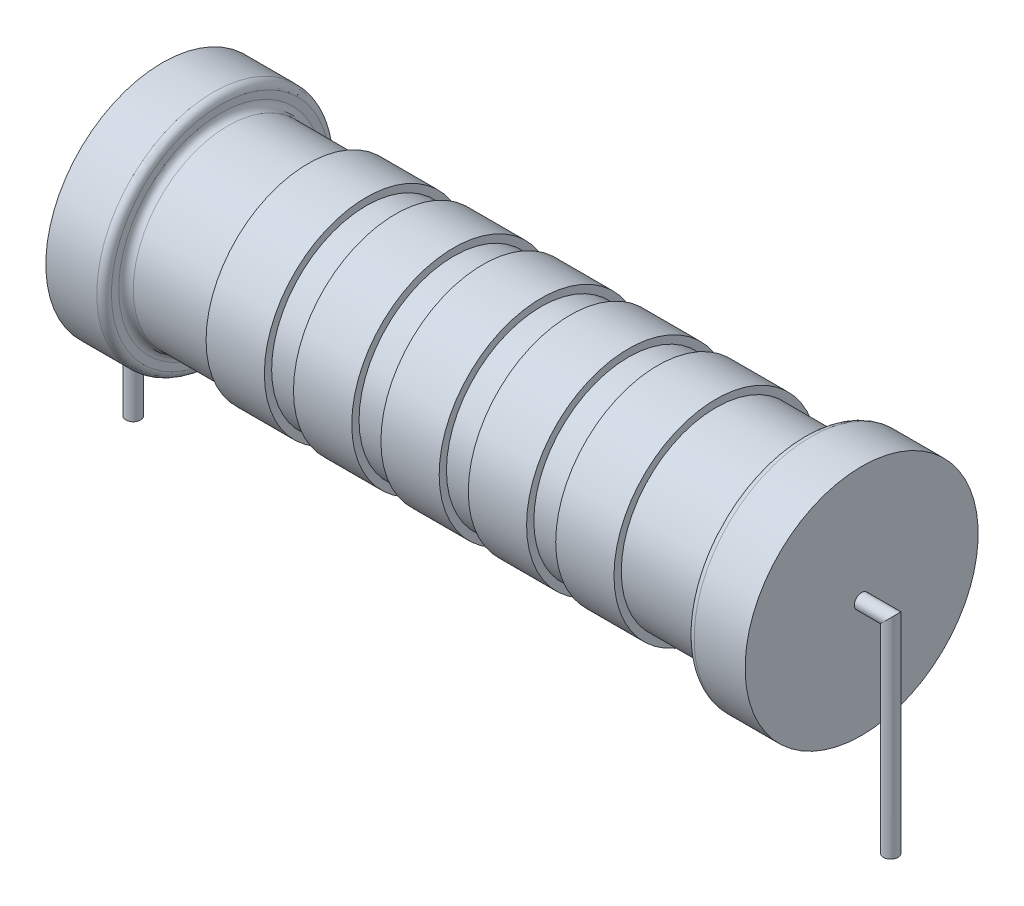
ISO-10303-21;
HEADER;
FILE_DESCRIPTION(('STEP AP214'),'2;1');
FILE_NAME('part.step','',(''),(''),'','','');
FILE_SCHEMA(('AUTOMOTIVE_DESIGN { 1 0 10303 214 1 1 1 1 }'));
ENDSEC;
DATA;
#1=APPLICATION_CONTEXT('core data for automotive mechanical design processes');
#2=APPLICATION_PROTOCOL_DEFINITION('international standard','automotive_design',2000,#1);
#3=PRODUCT_CONTEXT('',#1,'mechanical');
#4=PRODUCT('Part','Part','',(#3));
#5=PRODUCT_RELATED_PRODUCT_CATEGORY('part','',(#4));
#6=PRODUCT_DEFINITION_FORMATION('','',#4);
#7=PRODUCT_DEFINITION_CONTEXT('part definition',#1,'design');
#8=PRODUCT_DEFINITION('design','',#6,#7);
#9=PRODUCT_DEFINITION_SHAPE('','',#8);
#10=(LENGTH_UNIT() NAMED_UNIT(*) SI_UNIT(.MILLI.,.METRE.));
#11=(NAMED_UNIT(*) PLANE_ANGLE_UNIT() SI_UNIT($,.RADIAN.));
#12=(NAMED_UNIT(*) SI_UNIT($,.STERADIAN.) SOLID_ANGLE_UNIT());
#13=UNCERTAINTY_MEASURE_WITH_UNIT(LENGTH_MEASURE(1.E-05),#10,'distance_accuracy_value','');
#14=(GEOMETRIC_REPRESENTATION_CONTEXT(3) GLOBAL_UNCERTAINTY_ASSIGNED_CONTEXT((#13)) GLOBAL_UNIT_ASSIGNED_CONTEXT((#10,
#11,#12)) REPRESENTATION_CONTEXT('',''));
#15=CARTESIAN_POINT('',(0.,0.,0.));
#16=DIRECTION('',(0.,0.,1.));
#17=DIRECTION('',(1.,0.,0.));
#18=AXIS2_PLACEMENT_3D('',#15,#16,#17);
#19=CARTESIAN_POINT('',(-12.,0.,0.));
#20=DIRECTION('',(-1.,0.,0.));
#21=DIRECTION('',(0.,-1.,0.));
#22=AXIS2_PLACEMENT_3D('',#19,#20,#21);
#23=CYLINDRICAL_SURFACE('',#22,3.25000000000006);
#24=CARTESIAN_POINT('',(-4.,0.,0.));
#25=DIRECTION('',(1.,0.,0.));
#26=DIRECTION('',(0.,0.,-1.));
#27=AXIS2_PLACEMENT_3D('',#24,#25,#26);
#28=CIRCLE('',#27,3.25000000000006);
#29=CARTESIAN_POINT('',(-4.,0.,-3.25000000000006));
#30=VERTEX_POINT('',#29);
#31=EDGE_CURVE('E91',#30,#30,#28,.T.);
#32=ORIENTED_EDGE('',*,*,#31,.F.);
#33=EDGE_LOOP('',(#32));
#34=FACE_BOUND('',#33,.T.);
#35=CARTESIAN_POINT('',(-5.,0.,0.));
#36=DIRECTION('',(-1.,0.,0.));
#37=DIRECTION('',(0.,0.,1.));
#38=AXIS2_PLACEMENT_3D('',#35,#36,#37);
#39=CIRCLE('',#38,3.25000000000006);
#40=CARTESIAN_POINT('',(-5.,0.,3.25000000000006));
#41=VERTEX_POINT('',#40);
#42=EDGE_CURVE('E77',#41,#41,#39,.T.);
#43=ORIENTED_EDGE('',*,*,#42,.F.);
#44=EDGE_LOOP('',(#43));
#45=FACE_BOUND('',#44,.T.);
#46=ADVANCED_FACE('F62',(#34,#45),#23,.T.);
#47=CARTESIAN_POINT('',(-1.,0.,0.));
#48=DIRECTION('',(1.,0.,0.));
#49=DIRECTION('',(0.,0.,-1.));
#50=AXIS2_PLACEMENT_3D('',#47,#48,#49);
#51=CIRCLE('',#50,3.25000000000006);
#52=CARTESIAN_POINT('',(-1.,0.,-3.25000000000006));
#53=VERTEX_POINT('',#52);
#54=EDGE_CURVE('E115',#53,#53,#51,.T.);
#55=ORIENTED_EDGE('',*,*,#54,.F.);
#56=EDGE_LOOP('',(#55));
#57=FACE_BOUND('',#56,.T.);
#58=CARTESIAN_POINT('',(-2.,0.,0.));
#59=DIRECTION('',(-1.,0.,0.));
#60=DIRECTION('',(0.,0.,1.));
#61=AXIS2_PLACEMENT_3D('',#58,#59,#60);
#62=CIRCLE('',#61,3.25000000000006);
#63=CARTESIAN_POINT('',(-2.,0.,3.25000000000006));
#64=VERTEX_POINT('',#63);
#65=EDGE_CURVE('E88',#64,#64,#62,.T.);
#66=ORIENTED_EDGE('',*,*,#65,.F.);
#67=EDGE_LOOP('',(#66));
#68=FACE_BOUND('',#67,.T.);
#69=ADVANCED_FACE('F233',(#57,#68),#23,.T.);
#70=CARTESIAN_POINT('',(4.,0.,0.));
#71=DIRECTION('',(-1.,0.,0.));
#72=DIRECTION('',(0.,0.,1.));
#73=AXIS2_PLACEMENT_3D('',#70,#71,#72);
#74=CIRCLE('',#73,3.25000000000006);
#75=CARTESIAN_POINT('',(4.,0.,3.25000000000006));
#76=VERTEX_POINT('',#75);
#77=EDGE_CURVE('E103',#76,#76,#74,.T.);
#78=ORIENTED_EDGE('',*,*,#77,.F.);
#79=EDGE_LOOP('',(#78));
#80=FACE_BOUND('',#79,.T.);
#81=CARTESIAN_POINT('',(5.,0.,0.));
#82=DIRECTION('',(1.,0.,0.));
#83=DIRECTION('',(0.,0.,-1.));
#84=AXIS2_PLACEMENT_3D('',#81,#82,#83);
#85=CIRCLE('',#84,3.25000000000006);
#86=CARTESIAN_POINT('',(5.,0.,-3.25000000000006));
#87=VERTEX_POINT('',#86);
#88=EDGE_CURVE('E99',#87,#87,#85,.T.);
#89=ORIENTED_EDGE('',*,*,#88,.F.);
#90=EDGE_LOOP('',(#89));
#91=FACE_BOUND('',#90,.T.);
#92=ADVANCED_FACE('F240',(#80,#91),#23,.T.);
#93=CARTESIAN_POINT('',(0.999999999999999,0.,0.));
#94=DIRECTION('',(-1.,0.,0.));
#95=DIRECTION('',(0.,0.,1.));
#96=AXIS2_PLACEMENT_3D('',#93,#94,#95);
#97=CIRCLE('',#96,3.25000000000006);
#98=CARTESIAN_POINT('',(0.999999999999999,0.,3.25000000000006));
#99=VERTEX_POINT('',#98);
#100=EDGE_CURVE('E111',#99,#99,#97,.T.);
#101=ORIENTED_EDGE('',*,*,#100,.F.);
#102=EDGE_LOOP('',(#101));
#103=FACE_BOUND('',#102,.T.);
#104=CARTESIAN_POINT('',(2.,0.,0.));
#105=DIRECTION('',(1.,0.,0.));
#106=DIRECTION('',(0.,0.,-1.));
#107=AXIS2_PLACEMENT_3D('',#104,#105,#106);
#108=CIRCLE('',#107,3.25000000000006);
#109=CARTESIAN_POINT('',(2.,0.,-3.25000000000006));
#110=VERTEX_POINT('',#109);
#111=EDGE_CURVE('E107',#110,#110,#108,.T.);
#112=ORIENTED_EDGE('',*,*,#111,.F.);
#113=EDGE_LOOP('',(#112));
#114=FACE_BOUND('',#113,.T.);
#115=ADVANCED_FACE('F254',(#103,#114),#23,.T.);
#116=CARTESIAN_POINT('',(1.,3.00000000000006,0.));
#117=DIRECTION('',(-1.,0.,0.));
#118=DIRECTION('',(0.,0.,1.));
#119=AXIS2_PLACEMENT_3D('',#116,#117,#118);
#120=PLANE('',#119);
#121=ORIENTED_EDGE('',*,*,#100,.T.);
#122=EDGE_LOOP('',(#121));
#123=FACE_BOUND('',#122,.T.);
#124=CARTESIAN_POINT('',(0.99999999999989,0.,0.));
#125=DIRECTION('',(-1.,0.,0.));
#126=DIRECTION('',(0.,0.,1.));
#127=AXIS2_PLACEMENT_3D('',#124,#125,#126);
#128=CIRCLE('',#127,3.50000000000006);
#129=CARTESIAN_POINT('',(0.99999999999989,0.,3.50000000000006));
#130=VERTEX_POINT('',#129);
#131=EDGE_CURVE('E163',#130,#130,#128,.T.);
#132=ORIENTED_EDGE('',*,*,#131,.F.);
#133=EDGE_LOOP('',(#132));
#134=FACE_BOUND('',#133,.T.);
#135=ADVANCED_FACE('F267',(#123,#134),#120,.F.);
#136=CARTESIAN_POINT('',(-1.,3.00000000000006,0.));
#137=DIRECTION('',(1.,0.,0.));
#138=DIRECTION('',(0.,0.,-1.));
#139=AXIS2_PLACEMENT_3D('',#136,#137,#138);
#140=PLANE('',#139);
#141=ORIENTED_EDGE('',*,*,#54,.T.);
#142=EDGE_LOOP('',(#141));
#143=FACE_BOUND('',#142,.T.);
#144=CARTESIAN_POINT('',(-1.,0.,0.));
#145=DIRECTION('',(-1.,0.,0.));
#146=DIRECTION('',(0.,0.,1.));
#147=AXIS2_PLACEMENT_3D('',#144,#145,#146);
#148=CIRCLE('',#147,3.50000000000006);
#149=CARTESIAN_POINT('',(-1.,0.,3.50000000000006));
#150=VERTEX_POINT('',#149);
#151=EDGE_CURVE('E159',#150,#150,#148,.T.);
#152=ORIENTED_EDGE('',*,*,#151,.T.);
#153=EDGE_LOOP('',(#152));
#154=FACE_BOUND('',#153,.T.);
#155=ADVANCED_FACE('F273',(#143,#154),#140,.F.);
#156=CARTESIAN_POINT('',(-1000.,0.,0.));
#157=DIRECTION('',(-1.,0.,0.));
#158=DIRECTION('',(0.,0.,1.));
#159=AXIS2_PLACEMENT_3D('',#156,#157,#158);
#160=CYLINDRICAL_SURFACE('',#159,3.50000000000006);
#161=ORIENTED_EDGE('',*,*,#151,.F.);
#162=EDGE_LOOP('',(#161));
#163=FACE_BOUND('',#162,.T.);
#164=ORIENTED_EDGE('',*,*,#131,.T.);
#165=EDGE_LOOP('',(#164));
#166=FACE_BOUND('',#165,.T.);
#167=ADVANCED_FACE('F295',(#163,#166),#160,.T.);
#168=CARTESIAN_POINT('',(4.,3.00000000000006,0.));
#169=DIRECTION('',(-1.,0.,0.));
#170=DIRECTION('',(0.,0.,1.));
#171=AXIS2_PLACEMENT_3D('',#168,#169,#170);
#172=PLANE('',#171);
#173=ORIENTED_EDGE('',*,*,#77,.T.);
#174=EDGE_LOOP('',(#173));
#175=FACE_BOUND('',#174,.T.);
#176=CARTESIAN_POINT('',(4.,0.,0.));
#177=DIRECTION('',(-1.,0.,0.));
#178=DIRECTION('',(0.,0.,1.));
#179=AXIS2_PLACEMENT_3D('',#176,#177,#178);
#180=CIRCLE('',#179,3.50000000000006);
#181=CARTESIAN_POINT('',(4.,0.,3.50000000000006));
#182=VERTEX_POINT('',#181);
#183=EDGE_CURVE('E171',#182,#182,#180,.T.);
#184=ORIENTED_EDGE('',*,*,#183,.F.);
#185=EDGE_LOOP('',(#184));
#186=FACE_BOUND('',#185,.T.);
#187=ADVANCED_FACE('F284',(#175,#186),#172,.F.);
#188=CARTESIAN_POINT('',(2.,3.00000000000006,0.));
#189=DIRECTION('',(1.,0.,0.));
#190=DIRECTION('',(0.,0.,-1.));
#191=AXIS2_PLACEMENT_3D('',#188,#189,#190);
#192=PLANE('',#191);
#193=ORIENTED_EDGE('',*,*,#111,.T.);
#194=EDGE_LOOP('',(#193));
#195=FACE_BOUND('',#194,.T.);
#196=CARTESIAN_POINT('',(2.,0.,0.));
#197=DIRECTION('',(-1.,0.,0.));
#198=DIRECTION('',(0.,0.,1.));
#199=AXIS2_PLACEMENT_3D('',#196,#197,#198);
#200=CIRCLE('',#199,3.50000000000006);
#201=CARTESIAN_POINT('',(2.,0.,3.50000000000006));
#202=VERTEX_POINT('',#201);
#203=EDGE_CURVE('E167',#202,#202,#200,.T.);
#204=ORIENTED_EDGE('',*,*,#203,.T.);
#205=EDGE_LOOP('',(#204));
#206=FACE_BOUND('',#205,.T.);
#207=ADVANCED_FACE('F280',(#195,#206),#192,.F.);
#208=CARTESIAN_POINT('',(-1000.,0.,0.));
#209=DIRECTION('',(-1.,0.,0.));
#210=DIRECTION('',(0.,0.,1.));
#211=AXIS2_PLACEMENT_3D('',#208,#209,#210);
#212=CYLINDRICAL_SURFACE('',#211,3.50000000000006);
#213=ORIENTED_EDGE('',*,*,#203,.F.);
#214=EDGE_LOOP('',(#213));
#215=FACE_BOUND('',#214,.T.);
#216=ORIENTED_EDGE('',*,*,#183,.T.);
#217=EDGE_LOOP('',(#216));
#218=FACE_BOUND('',#217,.T.);
#219=ADVANCED_FACE('F283',(#215,#218),#212,.T.);
#220=CARTESIAN_POINT('',(7.,3.00000000000006,0.));
#221=DIRECTION('',(-1.,0.,0.));
#222=DIRECTION('',(0.,0.,1.));
#223=AXIS2_PLACEMENT_3D('',#220,#221,#222);
#224=PLANE('',#223);
#225=CARTESIAN_POINT('',(7.,0.,0.));
#226=DIRECTION('',(-1.,0.,0.));
#227=DIRECTION('',(0.,0.,1.));
#228=AXIS2_PLACEMENT_3D('',#225,#226,#227);
#229=CIRCLE('',#228,3.25000000000006);
#230=CARTESIAN_POINT('',(7.,0.,3.25000000000006));
#231=VERTEX_POINT('',#230);
#232=EDGE_CURVE('E95',#231,#231,#229,.T.);
#233=ORIENTED_EDGE('',*,*,#232,.T.);
#234=EDGE_LOOP('',(#233));
#235=FACE_BOUND('',#234,.T.);
#236=CARTESIAN_POINT('',(6.9999999999999,0.,0.));
#237=DIRECTION('',(-1.,0.,0.));
#238=DIRECTION('',(0.,0.,1.));
#239=AXIS2_PLACEMENT_3D('',#236,#237,#238);
#240=CIRCLE('',#239,3.50000000000006);
#241=CARTESIAN_POINT('',(6.9999999999999,0.,3.50000000000006));
#242=VERTEX_POINT('',#241);
#243=EDGE_CURVE('E179',#242,#242,#240,.T.);
#244=ORIENTED_EDGE('',*,*,#243,.F.);
#245=EDGE_LOOP('',(#244));
#246=FACE_BOUND('',#245,.T.);
#247=ADVANCED_FACE('F290',(#235,#246),#224,.F.);
#248=CARTESIAN_POINT('',(5.,3.00000000000006,0.));
#249=DIRECTION('',(1.,0.,0.));
#250=DIRECTION('',(0.,0.,-1.));
#251=AXIS2_PLACEMENT_3D('',#248,#249,#250);
#252=PLANE('',#251);
#253=ORIENTED_EDGE('',*,*,#88,.T.);
#254=EDGE_LOOP('',(#253));
#255=FACE_BOUND('',#254,.T.);
#256=CARTESIAN_POINT('',(4.99999999999989,0.,0.));
#257=DIRECTION('',(-1.,0.,0.));
#258=DIRECTION('',(0.,0.,1.));
#259=AXIS2_PLACEMENT_3D('',#256,#257,#258);
#260=CIRCLE('',#259,3.50000000000006);
#261=CARTESIAN_POINT('',(4.99999999999989,0.,3.50000000000006));
#262=VERTEX_POINT('',#261);
#263=EDGE_CURVE('E175',#262,#262,#260,.T.);
#264=ORIENTED_EDGE('',*,*,#263,.T.);
#265=EDGE_LOOP('',(#264));
#266=FACE_BOUND('',#265,.T.);
#267=ADVANCED_FACE('F340',(#255,#266),#252,.F.);
#268=CARTESIAN_POINT('',(-1000.,0.,0.));
#269=DIRECTION('',(-1.,0.,0.));
#270=DIRECTION('',(0.,0.,1.));
#271=AXIS2_PLACEMENT_3D('',#268,#269,#270);
#272=CYLINDRICAL_SURFACE('',#271,3.50000000000006);
#273=ORIENTED_EDGE('',*,*,#263,.F.);
#274=EDGE_LOOP('',(#273));
#275=FACE_BOUND('',#274,.T.);
#276=ORIENTED_EDGE('',*,*,#243,.T.);
#277=EDGE_LOOP('',(#276));
#278=FACE_BOUND('',#277,.T.);
#279=ADVANCED_FACE('F336',(#275,#278),#272,.T.);
#280=CARTESIAN_POINT('',(12.,0.,0.));
#281=DIRECTION('',(-1.,0.,0.));
#282=DIRECTION('',(0.,-1.,0.));
#283=AXIS2_PLACEMENT_3D('',#280,#281,#282);
#284=PLANE('',#283);
#285=CARTESIAN_POINT('',(12.,0.,0.));
#286=DIRECTION('',(-1.,0.,0.));
#287=DIRECTION('',(0.,-1.,0.));
#288=AXIS2_PLACEMENT_3D('',#285,#286,#287);
#289=CIRCLE('',#288,0.25);
#290=CARTESIAN_POINT('',(12.,-0.250000000000004,0.));
#291=VERTEX_POINT('',#290);
#292=EDGE_CURVE('E11',#291,#291,#289,.F.);
#293=ORIENTED_EDGE('',*,*,#292,.F.);
#294=EDGE_LOOP('',(#293));
#295=FACE_BOUND('',#294,.T.);
#296=CARTESIAN_POINT('',(12.,0.,0.));
#297=DIRECTION('',(-1.,0.,0.));
#298=DIRECTION('',(0.,-1.,0.));
#299=AXIS2_PLACEMENT_3D('',#296,#297,#298);
#300=CIRCLE('',#299,4.00000000000011);
#301=CARTESIAN_POINT('',(12.,-4.00000000000011,0.));
#302=VERTEX_POINT('',#301);
#303=EDGE_CURVE('E155',#302,#302,#300,.T.);
#304=ORIENTED_EDGE('',*,*,#303,.F.);
#305=EDGE_LOOP('',(#304));
#306=FACE_BOUND('',#305,.T.);
#307=ADVANCED_FACE('F339',(#295,#306),#284,.F.);
#308=CARTESIAN_POINT('',(-12.,0.,0.));
#309=DIRECTION('',(-1.,0.,0.));
#310=DIRECTION('',(0.,-1.,0.));
#311=AXIS2_PLACEMENT_3D('',#308,#309,#310);
#312=CYLINDRICAL_SURFACE('',#311,4.00000000000011);
#313=CARTESIAN_POINT('',(10.25,0.,0.));
#314=DIRECTION('',(1.,0.,0.));
#315=DIRECTION('',(0.,1.,0.));
#316=AXIS2_PLACEMENT_3D('',#313,#314,#315);
#317=CIRCLE('',#316,4.00000000000011);
#318=CARTESIAN_POINT('',(10.25,4.00000000000011,0.));
#319=VERTEX_POINT('',#318);
#320=EDGE_CURVE('E131',#319,#319,#317,.T.);
#321=ORIENTED_EDGE('',*,*,#320,.T.);
#322=EDGE_LOOP('',(#321));
#323=FACE_BOUND('',#322,.T.);
#324=ORIENTED_EDGE('',*,*,#303,.T.);
#325=EDGE_LOOP('',(#324));
#326=FACE_BOUND('',#325,.T.);
#327=ADVANCED_FACE('F366',(#323,#326),#312,.T.);
#328=CARTESIAN_POINT('',(10.25,0.,0.));
#329=DIRECTION('',(1.,0.,0.));
#330=DIRECTION('',(0.,1.,0.));
#331=AXIS2_PLACEMENT_3D('',#328,#329,#330);
#332=TOROIDAL_SURFACE('',#331,3.75000000000011,0.25);
#333=ORIENTED_EDGE('',*,*,#320,.F.);
#334=EDGE_LOOP('',(#333));
#335=FACE_BOUND('',#334,.T.);
#336=CARTESIAN_POINT('',(9.99999999999998,0.,0.));
#337=DIRECTION('',(1.,0.,0.));
#338=DIRECTION('',(0.,1.,0.));
#339=AXIS2_PLACEMENT_3D('',#336,#337,#338);
#340=CIRCLE('',#339,3.75000000000011);
#341=CARTESIAN_POINT('',(9.99999999999998,3.75000000000011,0.));
#342=VERTEX_POINT('',#341);
#343=EDGE_CURVE('E139',#342,#342,#340,.F.);
#344=ORIENTED_EDGE('',*,*,#343,.F.);
#345=EDGE_LOOP('',(#344));
#346=FACE_BOUND('',#345,.T.);
#347=ADVANCED_FACE('F373',(#335,#346),#332,.T.);
#348=CARTESIAN_POINT('',(9.99999999999998,4.00000000000011,0.));
#349=DIRECTION('',(1.,0.,0.));
#350=DIRECTION('',(0.,1.,0.));
#351=AXIS2_PLACEMENT_3D('',#348,#349,#350);
#352=PLANE('',#351);
#353=CARTESIAN_POINT('',(9.99999999999998,0.,0.));
#354=DIRECTION('',(1.,0.,0.));
#355=DIRECTION('',(0.,1.,0.));
#356=AXIS2_PLACEMENT_3D('',#353,#354,#355);
#357=CIRCLE('',#356,3.50000000000006);
#358=CARTESIAN_POINT('',(9.99999999999998,3.50000000000006,0.));
#359=VERTEX_POINT('',#358);
#360=EDGE_CURVE('E135',#359,#359,#357,.T.);
#361=ORIENTED_EDGE('',*,*,#360,.T.);
#362=EDGE_LOOP('',(#361));
#363=FACE_BOUND('',#362,.T.);
#364=ORIENTED_EDGE('',*,*,#343,.T.);
#365=EDGE_LOOP('',(#364));
#366=FACE_BOUND('',#365,.T.);
#367=ADVANCED_FACE('F262',(#363,#366),#352,.F.);
#368=CARTESIAN_POINT('',(9.74999999999998,0.,0.));
#369=DIRECTION('',(1.,0.,0.));
#370=DIRECTION('',(0.,1.,0.));
#371=AXIS2_PLACEMENT_3D('',#368,#369,#370);
#372=TOROIDAL_SURFACE('',#371,3.50000000000006,0.25);
#373=ORIENTED_EDGE('',*,*,#360,.F.);
#374=EDGE_LOOP('',(#373));
#375=FACE_BOUND('',#374,.T.);
#376=CARTESIAN_POINT('',(9.74999999999998,0.,0.));
#377=DIRECTION('',(1.,0.,0.));
#378=DIRECTION('',(0.,1.,0.));
#379=AXIS2_PLACEMENT_3D('',#376,#377,#378);
#380=CIRCLE('',#379,3.25000000000006);
#381=CARTESIAN_POINT('',(9.74999999999998,3.25000000000006,0.));
#382=VERTEX_POINT('',#381);
#383=EDGE_CURVE('E143',#382,#382,#380,.F.);
#384=ORIENTED_EDGE('',*,*,#383,.F.);
#385=EDGE_LOOP('',(#384));
#386=FACE_BOUND('',#385,.T.);
#387=ADVANCED_FACE('F252',(#375,#386),#372,.F.);
#388=ORIENTED_EDGE('',*,*,#383,.T.);
#389=EDGE_LOOP('',(#388));
#390=FACE_BOUND('',#389,.T.);
#391=ORIENTED_EDGE('',*,*,#232,.F.);
#392=EDGE_LOOP('',(#391));
#393=FACE_BOUND('',#392,.T.);
#394=ADVANCED_FACE('F236',(#390,#393),#23,.T.);
#395=CARTESIAN_POINT('',(-2.,3.00000000000004,0.));
#396=DIRECTION('',(-1.,0.,0.));
#397=DIRECTION('',(0.,0.,1.));
#398=AXIS2_PLACEMENT_3D('',#395,#396,#397);
#399=PLANE('',#398);
#400=ORIENTED_EDGE('',*,*,#65,.T.);
#401=EDGE_LOOP('',(#400));
#402=FACE_BOUND('',#401,.T.);
#403=CARTESIAN_POINT('',(-2.,0.,0.));
#404=DIRECTION('',(-1.,0.,0.));
#405=DIRECTION('',(0.,0.,1.));
#406=AXIS2_PLACEMENT_3D('',#403,#404,#405);
#407=CIRCLE('',#406,3.50000000000004);
#408=CARTESIAN_POINT('',(-2.,0.,3.50000000000004));
#409=VERTEX_POINT('',#408);
#410=EDGE_CURVE('E186',#409,#409,#407,.T.);
#411=ORIENTED_EDGE('',*,*,#410,.F.);
#412=EDGE_LOOP('',(#411));
#413=FACE_BOUND('',#412,.T.);
#414=ADVANCED_FACE('F251',(#402,#413),#399,.F.);
#415=CARTESIAN_POINT('',(-4.,3.00000000000004,0.));
#416=DIRECTION('',(1.,0.,0.));
#417=DIRECTION('',(0.,0.,-1.));
#418=AXIS2_PLACEMENT_3D('',#415,#416,#417);
#419=PLANE('',#418);
#420=ORIENTED_EDGE('',*,*,#31,.T.);
#421=EDGE_LOOP('',(#420));
#422=FACE_BOUND('',#421,.T.);
#423=CARTESIAN_POINT('',(-4.,0.,0.));
#424=DIRECTION('',(-1.,0.,0.));
#425=DIRECTION('',(0.,0.,1.));
#426=AXIS2_PLACEMENT_3D('',#423,#424,#425);
#427=CIRCLE('',#426,3.50000000000004);
#428=CARTESIAN_POINT('',(-4.,0.,3.50000000000004));
#429=VERTEX_POINT('',#428);
#430=EDGE_CURVE('E182',#429,#429,#427,.T.);
#431=ORIENTED_EDGE('',*,*,#430,.T.);
#432=EDGE_LOOP('',(#431));
#433=FACE_BOUND('',#432,.T.);
#434=ADVANCED_FACE('F259',(#422,#433),#419,.F.);
#435=CARTESIAN_POINT('',(-1000.,0.,0.));
#436=DIRECTION('',(-1.,0.,0.));
#437=DIRECTION('',(0.,0.,1.));
#438=AXIS2_PLACEMENT_3D('',#435,#436,#437);
#439=CYLINDRICAL_SURFACE('',#438,3.50000000000004);
#440=ORIENTED_EDGE('',*,*,#430,.F.);
#441=EDGE_LOOP('',(#440));
#442=FACE_BOUND('',#441,.T.);
#443=ORIENTED_EDGE('',*,*,#410,.T.);
#444=EDGE_LOOP('',(#443));
#445=FACE_BOUND('',#444,.T.);
#446=ADVANCED_FACE('F319',(#442,#445),#439,.T.);
#447=CARTESIAN_POINT('',(-5.,3.00000000000002,0.));
#448=DIRECTION('',(-1.,0.,0.));
#449=DIRECTION('',(0.,0.,1.));
#450=AXIS2_PLACEMENT_3D('',#447,#448,#449);
#451=PLANE('',#450);
#452=ORIENTED_EDGE('',*,*,#42,.T.);
#453=EDGE_LOOP('',(#452));
#454=FACE_BOUND('',#453,.T.);
#455=CARTESIAN_POINT('',(-5.,0.,0.));
#456=DIRECTION('',(-1.,0.,0.));
#457=DIRECTION('',(0.,0.,1.));
#458=AXIS2_PLACEMENT_3D('',#455,#456,#457);
#459=CIRCLE('',#458,3.50000000000002);
#460=CARTESIAN_POINT('',(-5.,0.,3.50000000000002));
#461=VERTEX_POINT('',#460);
#462=EDGE_CURVE('E194',#461,#461,#459,.T.);
#463=ORIENTED_EDGE('',*,*,#462,.F.);
#464=EDGE_LOOP('',(#463));
#465=FACE_BOUND('',#464,.T.);
#466=ADVANCED_FACE('F321',(#454,#465),#451,.F.);
#467=CARTESIAN_POINT('',(-7.,3.00000000000002,0.));
#468=DIRECTION('',(1.,0.,0.));
#469=DIRECTION('',(0.,0.,-1.));
#470=AXIS2_PLACEMENT_3D('',#467,#468,#469);
#471=PLANE('',#470);
#472=CARTESIAN_POINT('',(-7.,0.,0.));
#473=DIRECTION('',(1.,0.,0.));
#474=DIRECTION('',(0.,0.,-1.));
#475=AXIS2_PLACEMENT_3D('',#472,#473,#474);
#476=CIRCLE('',#475,3.25000000000006);
#477=CARTESIAN_POINT('',(-7.,0.,-3.25000000000006));
#478=VERTEX_POINT('',#477);
#479=EDGE_CURVE('E83',#478,#478,#476,.T.);
#480=ORIENTED_EDGE('',*,*,#479,.T.);
#481=EDGE_LOOP('',(#480));
#482=FACE_BOUND('',#481,.T.);
#483=CARTESIAN_POINT('',(-7.00000000000001,0.,0.));
#484=DIRECTION('',(-1.,0.,0.));
#485=DIRECTION('',(0.,0.,1.));
#486=AXIS2_PLACEMENT_3D('',#483,#484,#485);
#487=CIRCLE('',#486,3.50000000000002);
#488=CARTESIAN_POINT('',(-7.00000000000001,0.,3.50000000000002));
#489=VERTEX_POINT('',#488);
#490=EDGE_CURVE('E190',#489,#489,#487,.T.);
#491=ORIENTED_EDGE('',*,*,#490,.T.);
#492=EDGE_LOOP('',(#491));
#493=FACE_BOUND('',#492,.T.);
#494=ADVANCED_FACE('F328',(#482,#493),#471,.F.);
#495=CARTESIAN_POINT('',(-1000.,0.,0.));
#496=DIRECTION('',(-1.,0.,0.));
#497=DIRECTION('',(0.,0.,1.));
#498=AXIS2_PLACEMENT_3D('',#495,#496,#497);
#499=CYLINDRICAL_SURFACE('',#498,3.50000000000002);
#500=ORIENTED_EDGE('',*,*,#490,.F.);
#501=EDGE_LOOP('',(#500));
#502=FACE_BOUND('',#501,.T.);
#503=ORIENTED_EDGE('',*,*,#462,.T.);
#504=EDGE_LOOP('',(#503));
#505=FACE_BOUND('',#504,.T.);
#506=ADVANCED_FACE('F417',(#502,#505),#499,.T.);
#507=CARTESIAN_POINT('',(-12.,0.,0.));
#508=DIRECTION('',(1.,0.,0.));
#509=DIRECTION('',(0.,1.,0.));
#510=AXIS2_PLACEMENT_3D('',#507,#508,#509);
#511=PLANE('',#510);
#512=CARTESIAN_POINT('',(-12.,0.,0.));
#513=DIRECTION('',(1.,0.,0.));
#514=DIRECTION('',(0.,1.,0.));
#515=AXIS2_PLACEMENT_3D('',#512,#513,#514);
#516=CIRCLE('',#515,0.25);
#517=CARTESIAN_POINT('',(-12.,0.249999999999999,0.));
#518=VERTEX_POINT('',#517);
#519=EDGE_CURVE('E70',#518,#518,#516,.F.);
#520=ORIENTED_EDGE('',*,*,#519,.F.);
#521=EDGE_LOOP('',(#520));
#522=FACE_BOUND('',#521,.T.);
#523=CARTESIAN_POINT('',(-12.,0.,0.));
#524=DIRECTION('',(-1.,0.,0.));
#525=DIRECTION('',(0.,-1.,0.));
#526=AXIS2_PLACEMENT_3D('',#523,#524,#525);
#527=CIRCLE('',#526,4.);
#528=CARTESIAN_POINT('',(-12.,-4.,0.));
#529=VERTEX_POINT('',#528);
#530=EDGE_CURVE('E151',#529,#529,#527,.T.);
#531=ORIENTED_EDGE('',*,*,#530,.T.);
#532=EDGE_LOOP('',(#531));
#533=FACE_BOUND('',#532,.T.);
#534=ADVANCED_FACE('F425',(#522,#533),#511,.F.);
#535=CARTESIAN_POINT('',(-12.,0.,0.));
#536=DIRECTION('',(-1.,0.,0.));
#537=DIRECTION('',(0.,-1.,0.));
#538=AXIS2_PLACEMENT_3D('',#535,#536,#537);
#539=CYLINDRICAL_SURFACE('',#538,4.);
#540=CARTESIAN_POINT('',(-10.25,0.,0.));
#541=DIRECTION('',(-1.,0.,0.));
#542=DIRECTION('',(0.,-1.,0.));
#543=AXIS2_PLACEMENT_3D('',#540,#541,#542);
#544=CIRCLE('',#543,4.);
#545=CARTESIAN_POINT('',(-10.25,-4.,0.));
#546=VERTEX_POINT('',#545);
#547=EDGE_CURVE('E119',#546,#546,#544,.T.);
#548=ORIENTED_EDGE('',*,*,#547,.T.);
#549=EDGE_LOOP('',(#548));
#550=FACE_BOUND('',#549,.T.);
#551=ORIENTED_EDGE('',*,*,#530,.F.);
#552=EDGE_LOOP('',(#551));
#553=FACE_BOUND('',#552,.T.);
#554=ADVANCED_FACE('F435',(#550,#553),#539,.T.);
#555=CARTESIAN_POINT('',(-10.25,0.,0.));
#556=DIRECTION('',(-1.,0.,0.));
#557=DIRECTION('',(0.,-1.,0.));
#558=AXIS2_PLACEMENT_3D('',#555,#556,#557);
#559=TOROIDAL_SURFACE('',#558,3.75,0.25);
#560=CARTESIAN_POINT('',(-10.,0.,0.));
#561=DIRECTION('',(-1.,0.,0.));
#562=DIRECTION('',(0.,-1.,0.));
#563=AXIS2_PLACEMENT_3D('',#560,#561,#562);
#564=CIRCLE('',#563,3.75);
#565=CARTESIAN_POINT('',(-10.,-3.75,0.));
#566=VERTEX_POINT('',#565);
#567=EDGE_CURVE('E127',#566,#566,#564,.F.);
#568=ORIENTED_EDGE('',*,*,#567,.F.);
#569=EDGE_LOOP('',(#568));
#570=FACE_BOUND('',#569,.T.);
#571=ORIENTED_EDGE('',*,*,#547,.F.);
#572=EDGE_LOOP('',(#571));
#573=FACE_BOUND('',#572,.T.);
#574=ADVANCED_FACE('F64',(#570,#573),#559,.T.);
#575=CARTESIAN_POINT('',(-10.,4.,0.));
#576=DIRECTION('',(-1.,0.,0.));
#577=DIRECTION('',(0.,-1.,0.));
#578=AXIS2_PLACEMENT_3D('',#575,#576,#577);
#579=PLANE('',#578);
#580=CARTESIAN_POINT('',(-10.,0.,0.));
#581=DIRECTION('',(-1.,0.,0.));
#582=DIRECTION('',(0.,-1.,0.));
#583=AXIS2_PLACEMENT_3D('',#580,#581,#582);
#584=CIRCLE('',#583,3.50000000000006);
#585=CARTESIAN_POINT('',(-10.,-3.50000000000006,0.));
#586=VERTEX_POINT('',#585);
#587=EDGE_CURVE('E123',#586,#586,#584,.T.);
#588=ORIENTED_EDGE('',*,*,#587,.T.);
#589=EDGE_LOOP('',(#588));
#590=FACE_BOUND('',#589,.T.);
#591=ORIENTED_EDGE('',*,*,#567,.T.);
#592=EDGE_LOOP('',(#591));
#593=FACE_BOUND('',#592,.T.);
#594=ADVANCED_FACE('F454',(#590,#593),#579,.F.);
#595=CARTESIAN_POINT('',(-9.75,0.,0.));
#596=DIRECTION('',(-1.,0.,0.));
#597=DIRECTION('',(0.,-1.,0.));
#598=AXIS2_PLACEMENT_3D('',#595,#596,#597);
#599=TOROIDAL_SURFACE('',#598,3.50000000000006,0.25);
#600=CARTESIAN_POINT('',(-9.75,0.,0.));
#601=DIRECTION('',(-1.,0.,0.));
#602=DIRECTION('',(0.,-1.,0.));
#603=AXIS2_PLACEMENT_3D('',#600,#601,#602);
#604=CIRCLE('',#603,3.25000000000006);
#605=CARTESIAN_POINT('',(-9.75,-3.25000000000006,0.));
#606=VERTEX_POINT('',#605);
#607=EDGE_CURVE('E147',#606,#606,#604,.F.);
#608=ORIENTED_EDGE('',*,*,#607,.F.);
#609=EDGE_LOOP('',(#608));
#610=FACE_BOUND('',#609,.T.);
#611=ORIENTED_EDGE('',*,*,#587,.F.);
#612=EDGE_LOOP('',(#611));
#613=FACE_BOUND('',#612,.T.);
#614=ADVANCED_FACE('F247',(#610,#613),#599,.F.);
#615=ORIENTED_EDGE('',*,*,#607,.T.);
#616=EDGE_LOOP('',(#615));
#617=FACE_BOUND('',#616,.T.);
#618=ORIENTED_EDGE('',*,*,#479,.F.);
#619=EDGE_LOOP('',(#618));
#620=FACE_BOUND('',#619,.T.);
#621=ADVANCED_FACE('F229',(#617,#620),#23,.T.);
#622=CARTESIAN_POINT('',(-13.,-7.,0.));
#623=DIRECTION('',(0.,1.,0.));
#624=DIRECTION('',(0.,0.,1.));
#625=AXIS2_PLACEMENT_3D('',#622,#623,#624);
#626=PLANE('',#625);
#627=CARTESIAN_POINT('',(-13.,-7.,0.));
#628=DIRECTION('',(0.,1.,0.));
#629=DIRECTION('',(0.,0.,1.));
#630=AXIS2_PLACEMENT_3D('',#627,#628,#629);
#631=CIRCLE('',#630,0.25);
#632=CARTESIAN_POINT('',(-13.,-7.,0.25));
#633=VERTEX_POINT('',#632);
#634=EDGE_CURVE('E199',#633,#633,#631,.T.);
#635=ORIENTED_EDGE('',*,*,#634,.F.);
#636=EDGE_LOOP('',(#635));
#637=FACE_BOUND('',#636,.T.);
#638=ADVANCED_FACE('F221',(#637),#626,.F.);
#639=CARTESIAN_POINT('',(-13.,0.650000000000002,0.));
#640=DIRECTION('',(0.,-1.,0.));
#641=DIRECTION('',(0.,0.,-1.));
#642=AXIS2_PLACEMENT_3D('',#639,#640,#641);
#643=CYLINDRICAL_SURFACE('',#642,0.25);
#644=CARTESIAN_POINT('',(-13.,0.,0.));
#645=DIRECTION('',(-0.707106781186547,-0.707106781186547,0.));
#646=DIRECTION('',(-0.707106781186548,0.707106781186548,0.));
#647=AXIS2_PLACEMENT_3D('',#644,#645,#646);
#648=ELLIPSE('',#647,0.353553390593274,0.25);
#649=CARTESIAN_POINT('',(-13.25,0.249999999999998,0.));
#650=VERTEX_POINT('',#649);
#651=EDGE_CURVE('E198',#650,#650,#648,.T.);
#652=ORIENTED_EDGE('',*,*,#651,.T.);
#653=EDGE_LOOP('',(#652));
#654=FACE_BOUND('',#653,.T.);
#655=ORIENTED_EDGE('',*,*,#634,.T.);
#656=EDGE_LOOP('',(#655));
#657=FACE_BOUND('',#656,.T.);
#658=ADVANCED_FACE('F228',(#654,#657),#643,.T.);
#659=CARTESIAN_POINT('',(-12.,0.,0.));
#660=DIRECTION('',(-1.,0.,0.));
#661=DIRECTION('',(0.,-1.,0.));
#662=AXIS2_PLACEMENT_3D('',#659,#660,#661);
#663=CYLINDRICAL_SURFACE('',#662,0.25);
#664=ORIENTED_EDGE('',*,*,#519,.T.);
#665=EDGE_LOOP('',(#664));
#666=FACE_BOUND('',#665,.T.);
#667=ORIENTED_EDGE('',*,*,#651,.F.);
#668=EDGE_LOOP('',(#667));
#669=FACE_BOUND('',#668,.T.);
#670=ADVANCED_FACE('F249',(#666,#669),#663,.T.);
#671=CARTESIAN_POINT('',(13.,-7.,0.));
#672=DIRECTION('',(0.,1.,0.));
#673=DIRECTION('',(0.,0.,1.));
#674=AXIS2_PLACEMENT_3D('',#671,#672,#673);
#675=PLANE('',#674);
#676=CARTESIAN_POINT('',(13.,-7.,0.));
#677=DIRECTION('',(0.,-1.,0.));
#678=DIRECTION('',(0.,0.,1.));
#679=AXIS2_PLACEMENT_3D('',#676,#677,#678);
#680=CIRCLE('',#679,0.25);
#681=CARTESIAN_POINT('',(13.,-7.,0.25));
#682=VERTEX_POINT('',#681);
#683=EDGE_CURVE('E207',#682,#682,#680,.F.);
#684=ORIENTED_EDGE('',*,*,#683,.F.);
#685=EDGE_LOOP('',(#684));
#686=FACE_BOUND('',#685,.T.);
#687=ADVANCED_FACE('F225',(#686),#675,.F.);
#688=CARTESIAN_POINT('',(13.,0.650000000000002,0.));
#689=DIRECTION('',(0.,-1.,0.));
#690=DIRECTION('',(0.,0.,-1.));
#691=AXIS2_PLACEMENT_3D('',#688,#689,#690);
#692=CYLINDRICAL_SURFACE('',#691,0.25);
#693=CARTESIAN_POINT('',(13.,0.,0.));
#694=DIRECTION('',(0.707106781186547,-0.707106781186548,0.));
#695=DIRECTION('',(0.707106781186548,0.707106781186547,0.));
#696=AXIS2_PLACEMENT_3D('',#693,#694,#695);
#697=ELLIPSE('',#696,0.353553390593274,0.25);
#698=CARTESIAN_POINT('',(13.25,0.249999999999997,0.));
#699=VERTEX_POINT('',#698);
#700=EDGE_CURVE('E203',#699,#699,#697,.T.);
#701=ORIENTED_EDGE('',*,*,#700,.T.);
#702=EDGE_LOOP('',(#701));
#703=FACE_BOUND('',#702,.T.);
#704=ORIENTED_EDGE('',*,*,#683,.T.);
#705=EDGE_LOOP('',(#704));
#706=FACE_BOUND('',#705,.T.);
#707=ADVANCED_FACE('F215',(#703,#706),#692,.T.);
#708=CARTESIAN_POINT('',(12.,0.,0.));
#709=DIRECTION('',(1.,0.,0.));
#710=DIRECTION('',(0.,1.,0.));
#711=AXIS2_PLACEMENT_3D('',#708,#709,#710);
#712=CYLINDRICAL_SURFACE('',#711,0.25);
#713=ORIENTED_EDGE('',*,*,#292,.T.);
#714=EDGE_LOOP('',(#713));
#715=FACE_BOUND('',#714,.T.);
#716=ORIENTED_EDGE('',*,*,#700,.F.);
#717=EDGE_LOOP('',(#716));
#718=FACE_BOUND('',#717,.T.);
#719=ADVANCED_FACE('F218',(#715,#718),#712,.T.);
#720=CLOSED_SHELL('',(#46,#69,#92,#115,#135,#155,#167,#187,#207,#219,#247,#267,#279,#307,#327,
#347,#367,#387,#394,#414,#434,#446,#466,#494,#506,#534,#554,#574,#594,#614,#621,#638,#658,#670,
#687,#707,#719));
#721=MANIFOLD_SOLID_BREP('B2',#720);
#722=ADVANCED_BREP_SHAPE_REPRESENTATION('',(#18,#721),#14);
#723=SHAPE_DEFINITION_REPRESENTATION(#9,#722);
ENDSEC;
END-ISO-10303-21;
